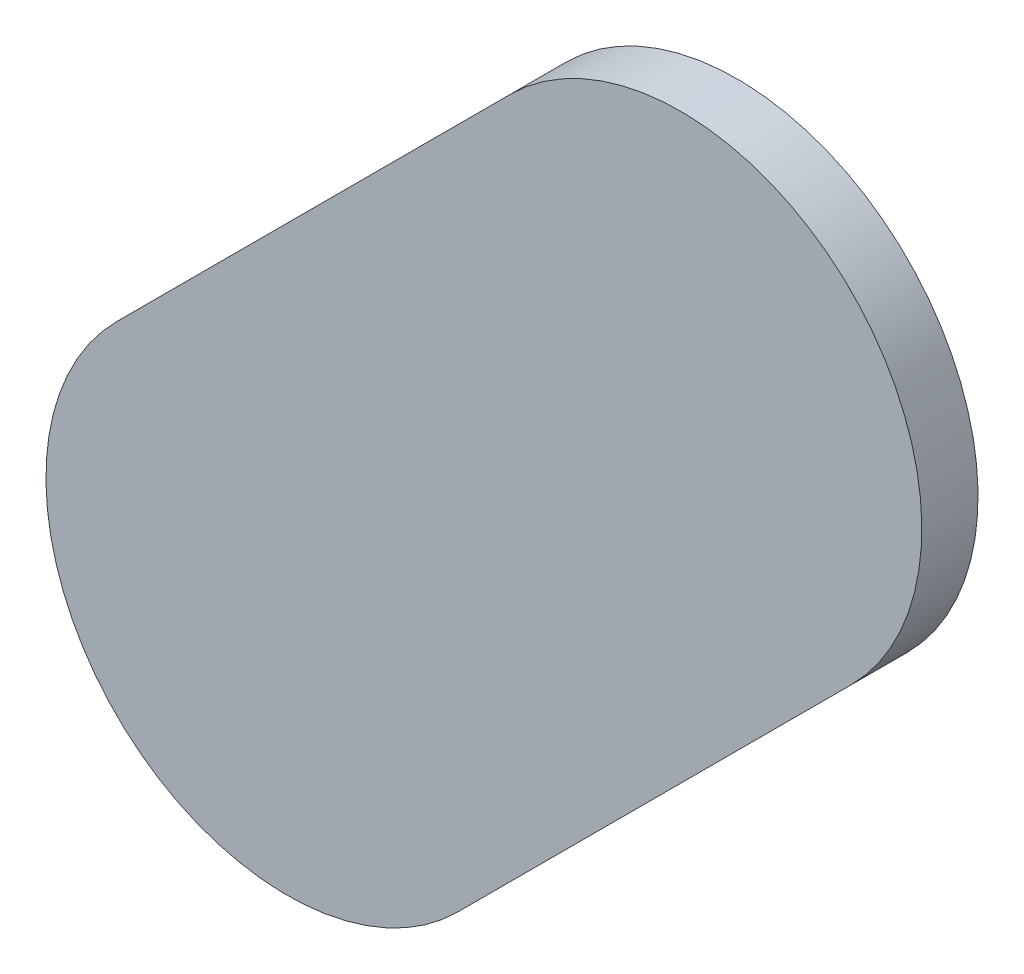
ISO-10303-21;
HEADER;
FILE_DESCRIPTION(('STEP AP214'),'2;1');
FILE_NAME('part.step','',(''),(''),'','','');
FILE_SCHEMA(('AUTOMOTIVE_DESIGN { 1 0 10303 214 1 1 1 1 }'));
ENDSEC;
DATA;
#1=APPLICATION_CONTEXT('core data for automotive mechanical design processes');
#2=APPLICATION_PROTOCOL_DEFINITION('international standard','automotive_design',2000,#1);
#3=PRODUCT_CONTEXT('',#1,'mechanical');
#4=PRODUCT('Part','Part','',(#3));
#5=PRODUCT_RELATED_PRODUCT_CATEGORY('part','',(#4));
#6=PRODUCT_DEFINITION_FORMATION('','',#4);
#7=PRODUCT_DEFINITION_CONTEXT('part definition',#1,'design');
#8=PRODUCT_DEFINITION('design','',#6,#7);
#9=PRODUCT_DEFINITION_SHAPE('','',#8);
#10=(LENGTH_UNIT() NAMED_UNIT(*) SI_UNIT(.MILLI.,.METRE.));
#11=(NAMED_UNIT(*) PLANE_ANGLE_UNIT() SI_UNIT($,.RADIAN.));
#12=(NAMED_UNIT(*) SI_UNIT($,.STERADIAN.) SOLID_ANGLE_UNIT());
#13=UNCERTAINTY_MEASURE_WITH_UNIT(LENGTH_MEASURE(1.E-05),#10,'distance_accuracy_value','');
#14=(GEOMETRIC_REPRESENTATION_CONTEXT(3) GLOBAL_UNCERTAINTY_ASSIGNED_CONTEXT((#13)) GLOBAL_UNIT_ASSIGNED_CONTEXT((#10,
#11,#12)) REPRESENTATION_CONTEXT('',''));
#15=CARTESIAN_POINT('',(0.,0.,0.));
#16=DIRECTION('',(0.,0.,1.));
#17=DIRECTION('',(1.,0.,0.));
#18=AXIS2_PLACEMENT_3D('',#15,#16,#17);
#19=CARTESIAN_POINT('',(88.163933,-108.243933,1.635));
#20=DIRECTION('',(0.,0.,1.));
#21=DIRECTION('',(1.,0.,0.));
#22=AXIS2_PLACEMENT_3D('',#19,#20,#21);
#23=PLANE('',#22);
#24=DIRECTION('',(-0.707106781186548,-0.707106781186548,0.));
#25=VECTOR('',#24,1.);
#26=CARTESIAN_POINT('',(88.163933,-108.243933,1.635));
#27=LINE('',#26,#25);
#28=CARTESIAN_POINT('',(88.163933,-108.243933,1.635));
#29=VERTEX_POINT('',#28);
#30=CARTESIAN_POINT('',(87.918933,-108.488933,1.635));
#31=VERTEX_POINT('',#30);
#32=EDGE_CURVE('E84',#29,#31,#27,.T.);
#33=ORIENTED_EDGE('',*,*,#32,.T.);
#34=CARTESIAN_POINT('',(88.0249995,-108.5949995,1.635));
#35=DIRECTION('',(0.,0.,1.));
#36=DIRECTION('',(-0.707106781186548,0.707106781186548,0.));
#37=AXIS2_PLACEMENT_3D('',#34,#35,#36);
#38=CIRCLE('',#37,0.150000682813);
#39=CARTESIAN_POINT('',(88.131066,-108.701066,1.635));
#40=VERTEX_POINT('',#39);
#41=EDGE_CURVE('E104',#31,#40,#38,.T.);
#42=ORIENTED_EDGE('',*,*,#41,.T.);
#43=DIRECTION('',(0.707106781186548,0.707106781186548,0.));
#44=VECTOR('',#43,1.);
#45=CARTESIAN_POINT('',(88.131066,-108.701066,1.635));
#46=LINE('',#45,#44);
#47=CARTESIAN_POINT('',(88.376066,-108.456066,1.635));
#48=VERTEX_POINT('',#47);
#49=EDGE_CURVE('E76',#40,#48,#46,.T.);
#50=ORIENTED_EDGE('',*,*,#49,.T.);
#51=CARTESIAN_POINT('',(88.2699995,-108.3499995,1.635));
#52=DIRECTION('',(0.,0.,1.));
#53=DIRECTION('',(0.707106781186548,-0.707106781186548,0.));
#54=AXIS2_PLACEMENT_3D('',#51,#52,#53);
#55=CIRCLE('',#54,0.150000682813);
#56=EDGE_CURVE('E11',#48,#29,#55,.T.);
#57=ORIENTED_EDGE('',*,*,#56,.T.);
#58=EDGE_LOOP('',(#33,#42,#50,#57));
#59=FACE_BOUND('',#58,.T.);
#60=ADVANCED_FACE('F17',(#59),#23,.T.);
#61=CARTESIAN_POINT('',(88.163933,-108.243933,1.6));
#62=DIRECTION('',(0.,0.,1.));
#63=DIRECTION('',(1.,0.,0.));
#64=AXIS2_PLACEMENT_3D('',#61,#62,#63);
#65=PLANE('',#64);
#66=CARTESIAN_POINT('',(88.2699995,-108.3499995,1.6));
#67=DIRECTION('',(0.,0.,1.));
#68=DIRECTION('',(0.707106781186548,-0.707106781186548,0.));
#69=AXIS2_PLACEMENT_3D('',#66,#67,#68);
#70=CIRCLE('',#69,0.150000682813);
#71=CARTESIAN_POINT('',(88.376066,-108.456066,1.6));
#72=VERTEX_POINT('',#71);
#73=CARTESIAN_POINT('',(88.163933,-108.243933,1.6));
#74=VERTEX_POINT('',#73);
#75=EDGE_CURVE('E27',#72,#74,#70,.T.);
#76=ORIENTED_EDGE('',*,*,#75,.F.);
#77=DIRECTION('',(0.707106781186548,0.707106781186548,0.));
#78=VECTOR('',#77,1.);
#79=CARTESIAN_POINT('',(88.131066,-108.701066,1.6));
#80=LINE('',#79,#78);
#81=CARTESIAN_POINT('',(88.131066,-108.701066,1.6));
#82=VERTEX_POINT('',#81);
#83=EDGE_CURVE('E101',#82,#72,#80,.T.);
#84=ORIENTED_EDGE('',*,*,#83,.F.);
#85=CARTESIAN_POINT('',(88.0249995,-108.5949995,1.6));
#86=DIRECTION('',(0.,0.,1.));
#87=DIRECTION('',(-0.707106781186548,0.707106781186548,0.));
#88=AXIS2_PLACEMENT_3D('',#85,#86,#87);
#89=CIRCLE('',#88,0.150000682813);
#90=CARTESIAN_POINT('',(87.918933,-108.488933,1.6));
#91=VERTEX_POINT('',#90);
#92=EDGE_CURVE('E86',#91,#82,#89,.T.);
#93=ORIENTED_EDGE('',*,*,#92,.F.);
#94=DIRECTION('',(-0.707106781186548,-0.707106781186548,0.));
#95=VECTOR('',#94,1.);
#96=CARTESIAN_POINT('',(88.163933,-108.243933,1.6));
#97=LINE('',#96,#95);
#98=EDGE_CURVE('E82',#74,#91,#97,.T.);
#99=ORIENTED_EDGE('',*,*,#98,.F.);
#100=EDGE_LOOP('',(#76,#84,#93,#99));
#101=FACE_BOUND('',#100,.T.);
#102=ADVANCED_FACE('F19',(#101),#65,.F.);
#103=CARTESIAN_POINT('',(88.2699995,-108.3499995,1.6));
#104=DIRECTION('',(0.,0.,-1.));
#105=DIRECTION('',(0.707106781186548,-0.707106781186548,0.));
#106=AXIS2_PLACEMENT_3D('',#103,#104,#105);
#107=CYLINDRICAL_SURFACE('',#106,0.150000682813);
#108=ORIENTED_EDGE('',*,*,#75,.T.);
#109=DIRECTION('',(0.,0.,1.));
#110=VECTOR('',#109,1.);
#111=CARTESIAN_POINT('',(88.163933,-108.243933,1.6));
#112=LINE('',#111,#110);
#113=EDGE_CURVE('E71',#74,#29,#112,.T.);
#114=ORIENTED_EDGE('',*,*,#113,.T.);
#115=ORIENTED_EDGE('',*,*,#56,.F.);
#116=DIRECTION('',(0.,0.,1.));
#117=VECTOR('',#116,1.);
#118=CARTESIAN_POINT('',(88.376066,-108.456066,1.6));
#119=LINE('',#118,#117);
#120=EDGE_CURVE('E21',#72,#48,#119,.T.);
#121=ORIENTED_EDGE('',*,*,#120,.F.);
#122=EDGE_LOOP('',(#108,#114,#115,#121));
#123=FACE_BOUND('',#122,.T.);
#124=ADVANCED_FACE('F70',(#123),#107,.T.);
#125=CARTESIAN_POINT('',(88.131066,-108.701066,1.6));
#126=DIRECTION('',(-0.707106781186548,0.707106781186548,0.));
#127=DIRECTION('',(0.,0.,1.));
#128=AXIS2_PLACEMENT_3D('',#125,#126,#127);
#129=PLANE('',#128);
#130=ORIENTED_EDGE('',*,*,#83,.T.);
#131=ORIENTED_EDGE('',*,*,#120,.T.);
#132=ORIENTED_EDGE('',*,*,#49,.F.);
#133=DIRECTION('',(0.,0.,1.));
#134=VECTOR('',#133,1.);
#135=CARTESIAN_POINT('',(88.131066,-108.701066,1.6));
#136=LINE('',#135,#134);
#137=EDGE_CURVE('E108',#82,#40,#136,.T.);
#138=ORIENTED_EDGE('',*,*,#137,.F.);
#139=EDGE_LOOP('',(#130,#131,#132,#138));
#140=FACE_BOUND('',#139,.T.);
#141=ADVANCED_FACE('F121',(#140),#129,.F.);
#142=CARTESIAN_POINT('',(88.0249995,-108.5949995,1.6));
#143=DIRECTION('',(0.,0.,-1.));
#144=DIRECTION('',(-0.707106781186548,0.707106781186548,0.));
#145=AXIS2_PLACEMENT_3D('',#142,#143,#144);
#146=CYLINDRICAL_SURFACE('',#145,0.150000682813);
#147=ORIENTED_EDGE('',*,*,#92,.T.);
#148=ORIENTED_EDGE('',*,*,#137,.T.);
#149=ORIENTED_EDGE('',*,*,#41,.F.);
#150=DIRECTION('',(0.,0.,1.));
#151=VECTOR('',#150,1.);
#152=CARTESIAN_POINT('',(87.918933,-108.488933,1.6));
#153=LINE('',#152,#151);
#154=EDGE_CURVE('E91',#91,#31,#153,.T.);
#155=ORIENTED_EDGE('',*,*,#154,.F.);
#156=EDGE_LOOP('',(#147,#148,#149,#155));
#157=FACE_BOUND('',#156,.T.);
#158=ADVANCED_FACE('F119',(#157),#146,.T.);
#159=CARTESIAN_POINT('',(88.163933,-108.243933,1.6));
#160=DIRECTION('',(0.707106781186548,-0.707106781186548,0.));
#161=DIRECTION('',(0.,0.,-1.));
#162=AXIS2_PLACEMENT_3D('',#159,#160,#161);
#163=PLANE('',#162);
#164=ORIENTED_EDGE('',*,*,#98,.T.);
#165=ORIENTED_EDGE('',*,*,#154,.T.);
#166=ORIENTED_EDGE('',*,*,#32,.F.);
#167=ORIENTED_EDGE('',*,*,#113,.F.);
#168=EDGE_LOOP('',(#164,#165,#166,#167));
#169=FACE_BOUND('',#168,.T.);
#170=ADVANCED_FACE('F80',(#169),#163,.F.);
#171=CLOSED_SHELL('',(#60,#102,#124,#141,#158,#170));
#172=MANIFOLD_SOLID_BREP('B1',#171);
#173=ADVANCED_BREP_SHAPE_REPRESENTATION('',(#18,#172),#14);
#174=SHAPE_DEFINITION_REPRESENTATION(#9,#173);
ENDSEC;
END-ISO-10303-21;
